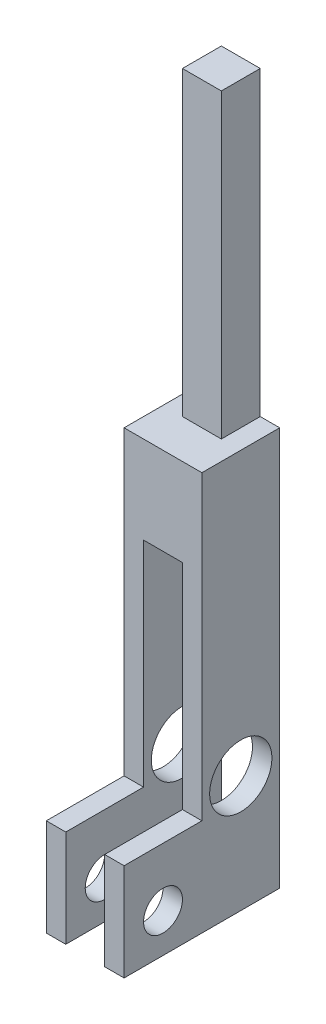
ISO-10303-21;
HEADER;
FILE_DESCRIPTION(('STEP AP214'),'2;1');
FILE_NAME('part.step','',(''),(''),'','','');
FILE_SCHEMA(('AUTOMOTIVE_DESIGN { 1 0 10303 214 1 1 1 1 }'));
ENDSEC;
DATA;
#1=APPLICATION_CONTEXT('core data for automotive mechanical design processes');
#2=APPLICATION_PROTOCOL_DEFINITION('international standard','automotive_design',2000,#1);
#3=PRODUCT_CONTEXT('',#1,'mechanical');
#4=PRODUCT('Part','Part','',(#3));
#5=PRODUCT_RELATED_PRODUCT_CATEGORY('part','',(#4));
#6=PRODUCT_DEFINITION_FORMATION('','',#4);
#7=PRODUCT_DEFINITION_CONTEXT('part definition',#1,'design');
#8=PRODUCT_DEFINITION('design','',#6,#7);
#9=PRODUCT_DEFINITION_SHAPE('','',#8);
#10=(LENGTH_UNIT() NAMED_UNIT(*) SI_UNIT(.MILLI.,.METRE.));
#11=(NAMED_UNIT(*) PLANE_ANGLE_UNIT() SI_UNIT($,.RADIAN.));
#12=(NAMED_UNIT(*) SI_UNIT($,.STERADIAN.) SOLID_ANGLE_UNIT());
#13=UNCERTAINTY_MEASURE_WITH_UNIT(LENGTH_MEASURE(1.E-05),#10,'distance_accuracy_value','');
#14=(GEOMETRIC_REPRESENTATION_CONTEXT(3) GLOBAL_UNCERTAINTY_ASSIGNED_CONTEXT((#13)) GLOBAL_UNIT_ASSIGNED_CONTEXT((#10,
#11,#12)) REPRESENTATION_CONTEXT('',''));
#15=CARTESIAN_POINT('',(0.,0.,0.));
#16=DIRECTION('',(0.,0.,1.));
#17=DIRECTION('',(1.,0.,0.));
#18=AXIS2_PLACEMENT_3D('',#15,#16,#17);
#19=CARTESIAN_POINT('',(0.,180.,0.));
#20=DIRECTION('',(0.,0.,-1.));
#21=DIRECTION('',(-1.,0.,0.));
#22=AXIS2_PLACEMENT_3D('',#19,#20,#21);
#23=PLANE('',#22);
#24=DIRECTION('',(1.,0.,0.));
#25=VECTOR('',#24,1.);
#26=CARTESIAN_POINT('',(0.,0.,0.));
#27=LINE('',#26,#25);
#28=CARTESIAN_POINT('',(0.,0.,0.));
#29=VERTEX_POINT('',#28);
#30=CARTESIAN_POINT('',(5.,0.,0.));
#31=VERTEX_POINT('',#30);
#32=EDGE_CURVE('E222',#29,#31,#27,.T.);
#33=ORIENTED_EDGE('',*,*,#32,.T.);
#34=DIRECTION('',(0.,1.,0.));
#35=VECTOR('',#34,1.);
#36=CARTESIAN_POINT('',(5.,180.,0.));
#37=LINE('',#36,#35);
#38=CARTESIAN_POINT('',(5.,25.,0.));
#39=VERTEX_POINT('',#38);
#40=EDGE_CURVE('E185',#31,#39,#37,.T.);
#41=ORIENTED_EDGE('',*,*,#40,.T.);
#42=DIRECTION('',(-1.,0.,0.));
#43=VECTOR('',#42,1.);
#44=CARTESIAN_POINT('',(28.9999999999999,25.,0.));
#45=LINE('',#44,#43);
#46=CARTESIAN_POINT('',(0.,25.,0.));
#47=VERTEX_POINT('',#46);
#48=EDGE_CURVE('E205',#39,#47,#45,.T.);
#49=ORIENTED_EDGE('',*,*,#48,.T.);
#50=DIRECTION('',(0.,-1.,0.));
#51=VECTOR('',#50,1.);
#52=CARTESIAN_POINT('',(0.,180.,0.));
#53=LINE('',#52,#51);
#54=EDGE_CURVE('E243',#47,#29,#53,.T.);
#55=ORIENTED_EDGE('',*,*,#54,.T.);
#56=EDGE_LOOP('',(#33,#41,#49,#55));
#57=FACE_BOUND('',#56,.T.);
#58=ADVANCED_FACE('F39',(#57),#23,.F.);
#59=CARTESIAN_POINT('',(0.,0.,0.));
#60=DIRECTION('',(0.,-1.,0.));
#61=DIRECTION('',(0.,0.,-1.));
#62=AXIS2_PLACEMENT_3D('',#59,#60,#61);
#63=PLANE('',#62);
#64=DIRECTION('',(0.,0.,-1.));
#65=VECTOR('',#64,1.);
#66=CARTESIAN_POINT('',(5.,0.,8.99999999999989));
#67=LINE('',#66,#65);
#68=CARTESIAN_POINT('',(5.,0.,-40.));
#69=VERTEX_POINT('',#68);
#70=EDGE_CURVE('E321',#31,#69,#67,.T.);
#71=ORIENTED_EDGE('',*,*,#70,.F.);
#72=ORIENTED_EDGE('',*,*,#32,.F.);
#73=DIRECTION('',(0.,0.,1.));
#74=VECTOR('',#73,1.);
#75=CARTESIAN_POINT('',(0.,0.,0.));
#76=LINE('',#75,#74);
#77=CARTESIAN_POINT('',(0.,0.,-40.));
#78=VERTEX_POINT('',#77);
#79=EDGE_CURVE('E212',#78,#29,#76,.T.);
#80=ORIENTED_EDGE('',*,*,#79,.F.);
#81=DIRECTION('',(-1.,0.,0.));
#82=VECTOR('',#81,1.);
#83=CARTESIAN_POINT('',(0.,0.,-40.));
#84=LINE('',#83,#82);
#85=EDGE_CURVE('E230',#69,#78,#84,.T.);
#86=ORIENTED_EDGE('',*,*,#85,.F.);
#87=EDGE_LOOP('',(#71,#72,#80,#86));
#88=FACE_BOUND('',#87,.T.);
#89=ADVANCED_FACE('F365',(#88),#63,.T.);
#90=CARTESIAN_POINT('',(28.9999999999999,25.,-20.));
#91=DIRECTION('',(0.,-1.,0.));
#92=DIRECTION('',(0.,0.,-1.));
#93=AXIS2_PLACEMENT_3D('',#90,#91,#92);
#94=PLANE('',#93);
#95=ORIENTED_EDGE('',*,*,#48,.F.);
#96=DIRECTION('',(0.,0.,-1.));
#97=VECTOR('',#96,1.);
#98=CARTESIAN_POINT('',(5.,25.,-20.));
#99=LINE('',#98,#97);
#100=CARTESIAN_POINT('',(5.,25.,-20.));
#101=VERTEX_POINT('',#100);
#102=EDGE_CURVE('E340',#39,#101,#99,.T.);
#103=ORIENTED_EDGE('',*,*,#102,.T.);
#104=DIRECTION('',(-1.,0.,0.));
#105=VECTOR('',#104,1.);
#106=CARTESIAN_POINT('',(28.9999999999999,25.,-20.));
#107=LINE('',#106,#105);
#108=CARTESIAN_POINT('',(0.,25.,-20.));
#109=VERTEX_POINT('',#108);
#110=EDGE_CURVE('E199',#101,#109,#107,.T.);
#111=ORIENTED_EDGE('',*,*,#110,.T.);
#112=DIRECTION('',(0.,0.,1.));
#113=VECTOR('',#112,1.);
#114=CARTESIAN_POINT('',(0.,25.,-20.));
#115=LINE('',#114,#113);
#116=EDGE_CURVE('E195',#109,#47,#115,.T.);
#117=ORIENTED_EDGE('',*,*,#116,.T.);
#118=EDGE_LOOP('',(#95,#103,#111,#117));
#119=FACE_BOUND('',#118,.T.);
#120=ADVANCED_FACE('F352',(#119),#94,.F.);
#121=CARTESIAN_POINT('',(0.,180.,0.));
#122=DIRECTION('',(1.,0.,0.));
#123=DIRECTION('',(0.,0.,-1.));
#124=AXIS2_PLACEMENT_3D('',#121,#122,#123);
#125=PLANE('',#124);
#126=CARTESIAN_POINT('',(0.,30.,-30.));
#127=DIRECTION('',(1.,0.,0.));
#128=DIRECTION('',(0.,0.,-1.));
#129=AXIS2_PLACEMENT_3D('',#126,#127,#128);
#130=CIRCLE('',#129,8.);
#131=CARTESIAN_POINT('',(0.,30.,-38.));
#132=VERTEX_POINT('',#131);
#133=EDGE_CURVE('E272',#132,#132,#130,.T.);
#134=ORIENTED_EDGE('',*,*,#133,.T.);
#135=EDGE_LOOP('',(#134));
#136=FACE_BOUND('',#135,.T.);
#137=CARTESIAN_POINT('',(0.,10.,-10.));
#138=DIRECTION('',(1.,0.,0.));
#139=DIRECTION('',(0.,0.,-1.));
#140=AXIS2_PLACEMENT_3D('',#137,#138,#139);
#141=CIRCLE('',#140,5.);
#142=CARTESIAN_POINT('',(0.,10.,-15.));
#143=VERTEX_POINT('',#142);
#144=EDGE_CURVE('E172',#143,#143,#141,.T.);
#145=ORIENTED_EDGE('',*,*,#144,.T.);
#146=EDGE_LOOP('',(#145));
#147=FACE_BOUND('',#146,.T.);
#148=DIRECTION('',(0.,0.,1.));
#149=VECTOR('',#148,1.);
#150=CARTESIAN_POINT('',(0.,102.5,-20.));
#151=LINE('',#150,#149);
#152=CARTESIAN_POINT('',(0.,102.5,-40.));
#153=VERTEX_POINT('',#152);
#154=CARTESIAN_POINT('',(0.,102.5,-20.));
#155=VERTEX_POINT('',#154);
#156=EDGE_CURVE('E179',#153,#155,#151,.T.);
#157=ORIENTED_EDGE('',*,*,#156,.F.);
#158=DIRECTION('',(0.,-1.,0.));
#159=VECTOR('',#158,1.);
#160=CARTESIAN_POINT('',(0.,180.,-40.));
#161=LINE('',#160,#159);
#162=EDGE_CURVE('E216',#153,#78,#161,.T.);
#163=ORIENTED_EDGE('',*,*,#162,.T.);
#164=ORIENTED_EDGE('',*,*,#79,.T.);
#165=ORIENTED_EDGE('',*,*,#54,.F.);
#166=ORIENTED_EDGE('',*,*,#116,.F.);
#167=DIRECTION('',(0.,-1.,0.));
#168=VECTOR('',#167,1.);
#169=CARTESIAN_POINT('',(0.,25.,-20.));
#170=LINE('',#169,#168);
#171=EDGE_CURVE('E191',#155,#109,#170,.T.);
#172=ORIENTED_EDGE('',*,*,#171,.F.);
#173=EDGE_LOOP('',(#157,#163,#164,#165,#166,#172));
#174=FACE_BOUND('',#173,.T.);
#175=ADVANCED_FACE('F41',(#136,#147,#174),#125,.F.);
#176=CARTESIAN_POINT('',(20.,25.,0.));
#177=VERTEX_POINT('',#176);
#178=CARTESIAN_POINT('',(15.,25.,0.));
#179=VERTEX_POINT('',#178);
#180=EDGE_CURVE('E200',#177,#179,#45,.T.);
#181=ORIENTED_EDGE('',*,*,#180,.T.);
#182=DIRECTION('',(0.,-1.,0.));
#183=VECTOR('',#182,1.);
#184=CARTESIAN_POINT('',(15.,180.,0.));
#185=LINE('',#184,#183);
#186=CARTESIAN_POINT('',(15.,0.,0.));
#187=VERTEX_POINT('',#186);
#188=EDGE_CURVE('E336',#179,#187,#185,.T.);
#189=ORIENTED_EDGE('',*,*,#188,.T.);
#190=CARTESIAN_POINT('',(20.,0.,0.));
#191=VERTEX_POINT('',#190);
#192=EDGE_CURVE('E221',#187,#191,#27,.T.);
#193=ORIENTED_EDGE('',*,*,#192,.T.);
#194=DIRECTION('',(0.,-1.,0.));
#195=VECTOR('',#194,1.);
#196=CARTESIAN_POINT('',(20.,180.,0.));
#197=LINE('',#196,#195);
#198=EDGE_CURVE('E239',#177,#191,#197,.T.);
#199=ORIENTED_EDGE('',*,*,#198,.F.);
#200=EDGE_LOOP('',(#181,#189,#193,#199));
#201=FACE_BOUND('',#200,.T.);
#202=ADVANCED_FACE('F388',(#201),#23,.F.);
#203=CARTESIAN_POINT('',(20.,180.,0.));
#204=DIRECTION('',(-1.,0.,0.));
#205=DIRECTION('',(0.,0.,1.));
#206=AXIS2_PLACEMENT_3D('',#203,#204,#205);
#207=PLANE('',#206);
#208=CARTESIAN_POINT('',(20.,30.,-30.));
#209=DIRECTION('',(1.,0.,0.));
#210=DIRECTION('',(0.,0.,-1.));
#211=AXIS2_PLACEMENT_3D('',#208,#209,#210);
#212=CIRCLE('',#211,8.);
#213=CARTESIAN_POINT('',(20.,30.,-38.));
#214=VERTEX_POINT('',#213);
#215=EDGE_CURVE('E457',#214,#214,#212,.T.);
#216=ORIENTED_EDGE('',*,*,#215,.F.);
#217=EDGE_LOOP('',(#216));
#218=FACE_BOUND('',#217,.T.);
#219=CARTESIAN_POINT('',(20.,10.,-10.));
#220=DIRECTION('',(1.,0.,0.));
#221=DIRECTION('',(0.,0.,-1.));
#222=AXIS2_PLACEMENT_3D('',#219,#220,#221);
#223=CIRCLE('',#222,5.);
#224=CARTESIAN_POINT('',(20.,10.,-15.));
#225=VERTEX_POINT('',#224);
#226=EDGE_CURVE('E264',#225,#225,#223,.T.);
#227=ORIENTED_EDGE('',*,*,#226,.F.);
#228=EDGE_LOOP('',(#227));
#229=FACE_BOUND('',#228,.T.);
#230=DIRECTION('',(0.,-1.,0.));
#231=VECTOR('',#230,1.);
#232=CARTESIAN_POINT('',(20.,180.,-40.));
#233=LINE('',#232,#231);
#234=CARTESIAN_POINT('',(20.,102.5,-40.));
#235=VERTEX_POINT('',#234);
#236=CARTESIAN_POINT('',(20.,0.,-40.));
#237=VERTEX_POINT('',#236);
#238=EDGE_CURVE('E236',#235,#237,#233,.T.);
#239=ORIENTED_EDGE('',*,*,#238,.F.);
#240=DIRECTION('',(0.,0.,1.));
#241=VECTOR('',#240,1.);
#242=CARTESIAN_POINT('',(20.,102.5,0.));
#243=LINE('',#242,#241);
#244=CARTESIAN_POINT('',(20.,102.5,-20.));
#245=VERTEX_POINT('',#244);
#246=EDGE_CURVE('E183',#235,#245,#243,.T.);
#247=ORIENTED_EDGE('',*,*,#246,.T.);
#248=DIRECTION('',(0.,-1.,0.));
#249=VECTOR('',#248,1.);
#250=CARTESIAN_POINT('',(20.,180.,-20.));
#251=LINE('',#250,#249);
#252=CARTESIAN_POINT('',(20.,25.,-20.));
#253=VERTEX_POINT('',#252);
#254=EDGE_CURVE('E204',#245,#253,#251,.T.);
#255=ORIENTED_EDGE('',*,*,#254,.T.);
#256=DIRECTION('',(0.,0.,1.));
#257=VECTOR('',#256,1.);
#258=CARTESIAN_POINT('',(20.,25.,0.));
#259=LINE('',#258,#257);
#260=EDGE_CURVE('E246',#253,#177,#259,.T.);
#261=ORIENTED_EDGE('',*,*,#260,.T.);
#262=ORIENTED_EDGE('',*,*,#198,.T.);
#263=DIRECTION('',(0.,0.,-1.));
#264=VECTOR('',#263,1.);
#265=CARTESIAN_POINT('',(20.,0.,0.));
#266=LINE('',#265,#264);
#267=EDGE_CURVE('E226',#191,#237,#266,.T.);
#268=ORIENTED_EDGE('',*,*,#267,.T.);
#269=EDGE_LOOP('',(#239,#247,#255,#261,#262,#268));
#270=FACE_BOUND('',#269,.T.);
#271=ADVANCED_FACE('F385',(#218,#229,#270),#207,.F.);
#272=CARTESIAN_POINT('',(0.,180.,-40.));
#273=DIRECTION('',(0.,0.,1.));
#274=DIRECTION('',(1.,0.,0.));
#275=AXIS2_PLACEMENT_3D('',#272,#273,#274);
#276=PLANE('',#275);
#277=DIRECTION('',(0.,-1.,0.));
#278=VECTOR('',#277,1.);
#279=CARTESIAN_POINT('',(15.,180.,-40.));
#280=LINE('',#279,#278);
#281=CARTESIAN_POINT('',(15.,180.,-40.));
#282=VERTEX_POINT('',#281);
#283=CARTESIAN_POINT('',(15.,102.5,-40.));
#284=VERTEX_POINT('',#283);
#285=EDGE_CURVE('E157',#282,#284,#280,.T.);
#286=ORIENTED_EDGE('',*,*,#285,.T.);
#287=DIRECTION('',(1.,0.,0.));
#288=VECTOR('',#287,1.);
#289=CARTESIAN_POINT('',(0.,102.5,-40.));
#290=LINE('',#289,#288);
#291=EDGE_CURVE('E289',#284,#235,#290,.T.);
#292=ORIENTED_EDGE('',*,*,#291,.T.);
#293=ORIENTED_EDGE('',*,*,#238,.T.);
#294=CARTESIAN_POINT('',(15.,0.,-40.));
#295=VERTEX_POINT('',#294);
#296=EDGE_CURVE('E217',#237,#295,#84,.T.);
#297=ORIENTED_EDGE('',*,*,#296,.T.);
#298=DIRECTION('',(0.,-1.,0.));
#299=VECTOR('',#298,1.);
#300=CARTESIAN_POINT('',(15.,0.,-40.));
#301=LINE('',#300,#299);
#302=CARTESIAN_POINT('',(15.,80.,-40.));
#303=VERTEX_POINT('',#302);
#304=EDGE_CURVE('E317',#303,#295,#301,.T.);
#305=ORIENTED_EDGE('',*,*,#304,.F.);
#306=DIRECTION('',(1.,0.,0.));
#307=VECTOR('',#306,1.);
#308=CARTESIAN_POINT('',(5.,80.,-40.));
#309=LINE('',#308,#307);
#310=CARTESIAN_POINT('',(5.,80.,-40.));
#311=VERTEX_POINT('',#310);
#312=EDGE_CURVE('E314',#311,#303,#309,.T.);
#313=ORIENTED_EDGE('',*,*,#312,.F.);
#314=DIRECTION('',(0.,1.,0.));
#315=VECTOR('',#314,1.);
#316=CARTESIAN_POINT('',(5.,0.,-40.));
#317=LINE('',#316,#315);
#318=EDGE_CURVE('E310',#69,#311,#317,.T.);
#319=ORIENTED_EDGE('',*,*,#318,.F.);
#320=ORIENTED_EDGE('',*,*,#85,.T.);
#321=ORIENTED_EDGE('',*,*,#162,.F.);
#322=DIRECTION('',(1.,0.,0.));
#323=VECTOR('',#322,1.);
#324=CARTESIAN_POINT('',(0.,102.5,-40.));
#325=LINE('',#324,#323);
#326=CARTESIAN_POINT('',(5.,102.5,-40.));
#327=VERTEX_POINT('',#326);
#328=EDGE_CURVE('E299',#153,#327,#325,.T.);
#329=ORIENTED_EDGE('',*,*,#328,.T.);
#330=DIRECTION('',(0.,1.,0.));
#331=VECTOR('',#330,1.);
#332=CARTESIAN_POINT('',(4.99999999999999,180.,-40.));
#333=LINE('',#332,#331);
#334=CARTESIAN_POINT('',(4.99999999999999,180.,-40.));
#335=VERTEX_POINT('',#334);
#336=EDGE_CURVE('E306',#327,#335,#333,.T.);
#337=ORIENTED_EDGE('',*,*,#336,.T.);
#338=DIRECTION('',(-1.,0.,0.));
#339=VECTOR('',#338,1.);
#340=CARTESIAN_POINT('',(0.,180.,-40.));
#341=LINE('',#340,#339);
#342=EDGE_CURVE('E213',#282,#335,#341,.T.);
#343=ORIENTED_EDGE('',*,*,#342,.F.);
#344=EDGE_LOOP('',(#286,#292,#293,#297,#305,#313,#319,#320,#321,#329,#337,#343));
#345=FACE_BOUND('',#344,.T.);
#346=ADVANCED_FACE('F373',(#345),#276,.F.);
#347=CARTESIAN_POINT('',(0.,180.,0.));
#348=DIRECTION('',(0.,-1.,0.));
#349=DIRECTION('',(0.,0.,-1.));
#350=AXIS2_PLACEMENT_3D('',#347,#348,#349);
#351=PLANE('',#350);
#352=DIRECTION('',(-1.,0.,0.));
#353=VECTOR('',#352,1.);
#354=CARTESIAN_POINT('',(28.9999999999999,180.,-30.));
#355=LINE('',#354,#353);
#356=CARTESIAN_POINT('',(15.,180.,-30.));
#357=VERTEX_POINT('',#356);
#358=CARTESIAN_POINT('',(4.99999999999999,180.,-30.));
#359=VERTEX_POINT('',#358);
#360=EDGE_CURVE('E168',#357,#359,#355,.T.);
#361=ORIENTED_EDGE('',*,*,#360,.F.);
#362=DIRECTION('',(0.,0.,1.));
#363=VECTOR('',#362,1.);
#364=CARTESIAN_POINT('',(15.,180.,-78.9999999999999));
#365=LINE('',#364,#363);
#366=EDGE_CURVE('E154',#282,#357,#365,.T.);
#367=ORIENTED_EDGE('',*,*,#366,.F.);
#368=ORIENTED_EDGE('',*,*,#342,.T.);
#369=DIRECTION('',(0.,0.,1.));
#370=VECTOR('',#369,1.);
#371=CARTESIAN_POINT('',(4.99999999999999,180.,-78.9999999999999));
#372=LINE('',#371,#370);
#373=EDGE_CURVE('E177',#335,#359,#372,.T.);
#374=ORIENTED_EDGE('',*,*,#373,.T.);
#375=EDGE_LOOP('',(#361,#367,#368,#374));
#376=FACE_BOUND('',#375,.T.);
#377=ADVANCED_FACE('F175',(#376),#351,.F.);
#378=DIRECTION('',(0.,0.,-1.));
#379=VECTOR('',#378,1.);
#380=CARTESIAN_POINT('',(15.,0.,8.99999999999989));
#381=LINE('',#380,#379);
#382=EDGE_CURVE('E325',#187,#295,#381,.T.);
#383=ORIENTED_EDGE('',*,*,#382,.T.);
#384=ORIENTED_EDGE('',*,*,#296,.F.);
#385=ORIENTED_EDGE('',*,*,#267,.F.);
#386=ORIENTED_EDGE('',*,*,#192,.F.);
#387=EDGE_LOOP('',(#383,#384,#385,#386));
#388=FACE_BOUND('',#387,.T.);
#389=ADVANCED_FACE('F393',(#388),#63,.T.);
#390=CARTESIAN_POINT('',(15.,25.,-20.));
#391=VERTEX_POINT('',#390);
#392=EDGE_CURVE('E206',#253,#391,#107,.T.);
#393=ORIENTED_EDGE('',*,*,#392,.T.);
#394=DIRECTION('',(0.,0.,1.));
#395=VECTOR('',#394,1.);
#396=CARTESIAN_POINT('',(15.,25.,-20.));
#397=LINE('',#396,#395);
#398=EDGE_CURVE('E324',#391,#179,#397,.T.);
#399=ORIENTED_EDGE('',*,*,#398,.T.);
#400=ORIENTED_EDGE('',*,*,#180,.F.);
#401=ORIENTED_EDGE('',*,*,#260,.F.);
#402=EDGE_LOOP('',(#393,#399,#400,#401));
#403=FACE_BOUND('',#402,.T.);
#404=ADVANCED_FACE('F381',(#403),#94,.F.);
#405=CARTESIAN_POINT('',(28.9999999999999,25.,-20.));
#406=DIRECTION('',(0.,0.,-1.));
#407=DIRECTION('',(-1.,0.,0.));
#408=AXIS2_PLACEMENT_3D('',#405,#406,#407);
#409=PLANE('',#408);
#410=ORIENTED_EDGE('',*,*,#110,.F.);
#411=DIRECTION('',(0.,1.,0.));
#412=VECTOR('',#411,1.);
#413=CARTESIAN_POINT('',(5.,25.,-20.));
#414=LINE('',#413,#412);
#415=CARTESIAN_POINT('',(5.,80.,-20.));
#416=VERTEX_POINT('',#415);
#417=EDGE_CURVE('E11',#101,#416,#414,.T.);
#418=ORIENTED_EDGE('',*,*,#417,.T.);
#419=DIRECTION('',(1.,0.,0.));
#420=VECTOR('',#419,1.);
#421=CARTESIAN_POINT('',(28.9999999999999,80.,-20.));
#422=LINE('',#421,#420);
#423=CARTESIAN_POINT('',(15.,80.,-20.));
#424=VERTEX_POINT('',#423);
#425=EDGE_CURVE('E254',#416,#424,#422,.T.);
#426=ORIENTED_EDGE('',*,*,#425,.T.);
#427=DIRECTION('',(0.,-1.,0.));
#428=VECTOR('',#427,1.);
#429=CARTESIAN_POINT('',(15.,25.,-20.));
#430=LINE('',#429,#428);
#431=EDGE_CURVE('E49',#424,#391,#430,.T.);
#432=ORIENTED_EDGE('',*,*,#431,.T.);
#433=ORIENTED_EDGE('',*,*,#392,.F.);
#434=ORIENTED_EDGE('',*,*,#254,.F.);
#435=DIRECTION('',(-1.,0.,0.));
#436=VECTOR('',#435,1.);
#437=CARTESIAN_POINT('',(28.9999999999999,102.5,-20.));
#438=LINE('',#437,#436);
#439=EDGE_CURVE('E250',#245,#155,#438,.T.);
#440=ORIENTED_EDGE('',*,*,#439,.T.);
#441=ORIENTED_EDGE('',*,*,#171,.T.);
#442=EDGE_LOOP('',(#410,#418,#426,#432,#433,#434,#440,#441));
#443=FACE_BOUND('',#442,.T.);
#444=ADVANCED_FACE('F360',(#443),#409,.F.);
#445=CARTESIAN_POINT('',(28.9999999999999,102.5,-30.));
#446=DIRECTION('',(0.,0.,-1.));
#447=DIRECTION('',(-1.,0.,0.));
#448=AXIS2_PLACEMENT_3D('',#445,#446,#447);
#449=PLANE('',#448);
#450=DIRECTION('',(-1.,0.,0.));
#451=VECTOR('',#450,1.);
#452=CARTESIAN_POINT('',(28.9999999999999,102.5,-30.));
#453=LINE('',#452,#451);
#454=CARTESIAN_POINT('',(15.,102.5,-30.));
#455=VERTEX_POINT('',#454);
#456=CARTESIAN_POINT('',(5.,102.5,-30.));
#457=VERTEX_POINT('',#456);
#458=EDGE_CURVE('E170',#455,#457,#453,.T.);
#459=ORIENTED_EDGE('',*,*,#458,.F.);
#460=DIRECTION('',(0.,-1.,0.));
#461=VECTOR('',#460,1.);
#462=CARTESIAN_POINT('',(15.,180.,-30.));
#463=LINE('',#462,#461);
#464=EDGE_CURVE('E57',#357,#455,#463,.T.);
#465=ORIENTED_EDGE('',*,*,#464,.F.);
#466=ORIENTED_EDGE('',*,*,#360,.T.);
#467=DIRECTION('',(0.,1.,0.));
#468=VECTOR('',#467,1.);
#469=CARTESIAN_POINT('',(4.99999999999999,180.,-30.));
#470=LINE('',#469,#468);
#471=EDGE_CURVE('E293',#457,#359,#470,.T.);
#472=ORIENTED_EDGE('',*,*,#471,.F.);
#473=EDGE_LOOP('',(#459,#465,#466,#472));
#474=FACE_BOUND('',#473,.T.);
#475=ADVANCED_FACE('F166',(#474),#449,.F.);
#476=CARTESIAN_POINT('',(28.9999999999999,102.5,-20.));
#477=DIRECTION('',(0.,-1.,0.));
#478=DIRECTION('',(0.,0.,-1.));
#479=AXIS2_PLACEMENT_3D('',#476,#477,#478);
#480=PLANE('',#479);
#481=ORIENTED_EDGE('',*,*,#246,.F.);
#482=ORIENTED_EDGE('',*,*,#291,.F.);
#483=DIRECTION('',(0.,0.,1.));
#484=VECTOR('',#483,1.);
#485=CARTESIAN_POINT('',(15.,102.5,-78.9999999999999));
#486=LINE('',#485,#484);
#487=EDGE_CURVE('E162',#284,#455,#486,.T.);
#488=ORIENTED_EDGE('',*,*,#487,.T.);
#489=ORIENTED_EDGE('',*,*,#458,.T.);
#490=DIRECTION('',(0.,0.,1.));
#491=VECTOR('',#490,1.);
#492=CARTESIAN_POINT('',(5.,102.5,-78.9999999999999));
#493=LINE('',#492,#491);
#494=EDGE_CURVE('E296',#327,#457,#493,.T.);
#495=ORIENTED_EDGE('',*,*,#494,.F.);
#496=ORIENTED_EDGE('',*,*,#328,.F.);
#497=ORIENTED_EDGE('',*,*,#156,.T.);
#498=ORIENTED_EDGE('',*,*,#439,.F.);
#499=EDGE_LOOP('',(#481,#482,#488,#489,#495,#496,#497,#498));
#500=FACE_BOUND('',#499,.T.);
#501=ADVANCED_FACE('F396',(#500),#480,.F.);
#502=CARTESIAN_POINT('',(5.,0.,8.99999999999989));
#503=DIRECTION('',(-1.,0.,0.));
#504=DIRECTION('',(0.,0.,1.));
#505=AXIS2_PLACEMENT_3D('',#502,#503,#504);
#506=PLANE('',#505);
#507=CARTESIAN_POINT('',(5.,30.,-30.));
#508=DIRECTION('',(-1.,0.,0.));
#509=DIRECTION('',(0.,0.,1.));
#510=AXIS2_PLACEMENT_3D('',#507,#508,#509);
#511=CIRCLE('',#510,8.);
#512=CARTESIAN_POINT('',(5.,30.,-22.));
#513=VERTEX_POINT('',#512);
#514=EDGE_CURVE('E278',#513,#513,#511,.T.);
#515=ORIENTED_EDGE('',*,*,#514,.T.);
#516=EDGE_LOOP('',(#515));
#517=FACE_BOUND('',#516,.T.);
#518=CARTESIAN_POINT('',(5.,10.,-10.));
#519=DIRECTION('',(-1.,0.,0.));
#520=DIRECTION('',(0.,0.,1.));
#521=AXIS2_PLACEMENT_3D('',#518,#519,#520);
#522=CIRCLE('',#521,5.);
#523=CARTESIAN_POINT('',(5.,10.,-5.));
#524=VERTEX_POINT('',#523);
#525=EDGE_CURVE('E263',#524,#524,#522,.T.);
#526=ORIENTED_EDGE('',*,*,#525,.T.);
#527=EDGE_LOOP('',(#526));
#528=FACE_BOUND('',#527,.T.);
#529=ORIENTED_EDGE('',*,*,#70,.T.);
#530=ORIENTED_EDGE('',*,*,#318,.T.);
#531=DIRECTION('',(0.,0.,-1.));
#532=VECTOR('',#531,1.);
#533=CARTESIAN_POINT('',(5.,80.,8.99999999999989));
#534=LINE('',#533,#532);
#535=EDGE_CURVE('E320',#416,#311,#534,.T.);
#536=ORIENTED_EDGE('',*,*,#535,.F.);
#537=ORIENTED_EDGE('',*,*,#417,.F.);
#538=ORIENTED_EDGE('',*,*,#102,.F.);
#539=ORIENTED_EDGE('',*,*,#40,.F.);
#540=EDGE_LOOP('',(#529,#530,#536,#537,#538,#539));
#541=FACE_BOUND('',#540,.T.);
#542=ADVANCED_FACE('F369',(#517,#528,#541),#506,.F.);
#543=CARTESIAN_POINT('',(15.,0.,8.99999999999989));
#544=DIRECTION('',(1.,0.,0.));
#545=DIRECTION('',(0.,0.,-1.));
#546=AXIS2_PLACEMENT_3D('',#543,#544,#545);
#547=PLANE('',#546);
#548=CARTESIAN_POINT('',(15.,30.,-30.));
#549=DIRECTION('',(1.,0.,0.));
#550=DIRECTION('',(0.,0.,-1.));
#551=AXIS2_PLACEMENT_3D('',#548,#549,#550);
#552=CIRCLE('',#551,8.);
#553=CARTESIAN_POINT('',(15.,30.,-38.));
#554=VERTEX_POINT('',#553);
#555=EDGE_CURVE('E43',#554,#554,#552,.T.);
#556=ORIENTED_EDGE('',*,*,#555,.T.);
#557=EDGE_LOOP('',(#556));
#558=FACE_BOUND('',#557,.T.);
#559=CARTESIAN_POINT('',(15.,10.,-10.));
#560=DIRECTION('',(1.,0.,0.));
#561=DIRECTION('',(0.,0.,-1.));
#562=AXIS2_PLACEMENT_3D('',#559,#560,#561);
#563=CIRCLE('',#562,5.);
#564=CARTESIAN_POINT('',(15.,10.,-15.));
#565=VERTEX_POINT('',#564);
#566=EDGE_CURVE('E260',#565,#565,#563,.T.);
#567=ORIENTED_EDGE('',*,*,#566,.T.);
#568=EDGE_LOOP('',(#567));
#569=FACE_BOUND('',#568,.T.);
#570=ORIENTED_EDGE('',*,*,#398,.F.);
#571=ORIENTED_EDGE('',*,*,#431,.F.);
#572=DIRECTION('',(0.,0.,-1.));
#573=VECTOR('',#572,1.);
#574=CARTESIAN_POINT('',(15.,80.,8.99999999999989));
#575=LINE('',#574,#573);
#576=EDGE_CURVE('E65',#424,#303,#575,.T.);
#577=ORIENTED_EDGE('',*,*,#576,.T.);
#578=ORIENTED_EDGE('',*,*,#304,.T.);
#579=ORIENTED_EDGE('',*,*,#382,.F.);
#580=ORIENTED_EDGE('',*,*,#188,.F.);
#581=EDGE_LOOP('',(#570,#571,#577,#578,#579,#580));
#582=FACE_BOUND('',#581,.T.);
#583=ADVANCED_FACE('F409',(#558,#569,#582),#547,.F.);
#584=CARTESIAN_POINT('',(5.,80.,8.99999999999989));
#585=DIRECTION('',(0.,1.,0.));
#586=DIRECTION('',(0.,0.,1.));
#587=AXIS2_PLACEMENT_3D('',#584,#585,#586);
#588=PLANE('',#587);
#589=ORIENTED_EDGE('',*,*,#535,.T.);
#590=ORIENTED_EDGE('',*,*,#312,.T.);
#591=ORIENTED_EDGE('',*,*,#576,.F.);
#592=ORIENTED_EDGE('',*,*,#425,.F.);
#593=EDGE_LOOP('',(#589,#590,#591,#592));
#594=FACE_BOUND('',#593,.T.);
#595=ADVANCED_FACE('F376',(#594),#588,.F.);
#596=CARTESIAN_POINT('',(4.99999999999999,180.,-78.9999999999999));
#597=DIRECTION('',(1.,0.,0.));
#598=DIRECTION('',(0.,1.,0.));
#599=AXIS2_PLACEMENT_3D('',#596,#597,#598);
#600=PLANE('',#599);
#601=ORIENTED_EDGE('',*,*,#494,.T.);
#602=ORIENTED_EDGE('',*,*,#471,.T.);
#603=ORIENTED_EDGE('',*,*,#373,.F.);
#604=ORIENTED_EDGE('',*,*,#336,.F.);
#605=EDGE_LOOP('',(#601,#602,#603,#604));
#606=FACE_BOUND('',#605,.T.);
#607=ADVANCED_FACE('F400',(#606),#600,.F.);
#608=CARTESIAN_POINT('',(15.,180.,-78.9999999999999));
#609=DIRECTION('',(-1.,0.,0.));
#610=DIRECTION('',(0.,-1.,0.));
#611=AXIS2_PLACEMENT_3D('',#608,#609,#610);
#612=PLANE('',#611);
#613=ORIENTED_EDGE('',*,*,#366,.T.);
#614=ORIENTED_EDGE('',*,*,#464,.T.);
#615=ORIENTED_EDGE('',*,*,#487,.F.);
#616=ORIENTED_EDGE('',*,*,#285,.F.);
#617=EDGE_LOOP('',(#613,#614,#615,#616));
#618=FACE_BOUND('',#617,.T.);
#619=ADVANCED_FACE('F155',(#618),#612,.F.);
#620=CARTESIAN_POINT('',(-28.9999999999999,10.,-10.));
#621=DIRECTION('',(1.,0.,0.));
#622=DIRECTION('',(0.,0.,-1.));
#623=AXIS2_PLACEMENT_3D('',#620,#621,#622);
#624=CYLINDRICAL_SURFACE('',#623,5.);
#625=ORIENTED_EDGE('',*,*,#226,.T.);
#626=EDGE_LOOP('',(#625));
#627=FACE_BOUND('',#626,.T.);
#628=ORIENTED_EDGE('',*,*,#566,.F.);
#629=EDGE_LOOP('',(#628));
#630=FACE_BOUND('',#629,.T.);
#631=ADVANCED_FACE('F407',(#627,#630),#624,.F.);
#632=ORIENTED_EDGE('',*,*,#525,.F.);
#633=EDGE_LOOP('',(#632));
#634=FACE_BOUND('',#633,.T.);
#635=ORIENTED_EDGE('',*,*,#144,.F.);
#636=EDGE_LOOP('',(#635));
#637=FACE_BOUND('',#636,.T.);
#638=ADVANCED_FACE('F433',(#634,#637),#624,.F.);
#639=CARTESIAN_POINT('',(-28.9999999999999,30.,-30.));
#640=DIRECTION('',(1.,0.,0.));
#641=DIRECTION('',(0.,0.,-1.));
#642=AXIS2_PLACEMENT_3D('',#639,#640,#641);
#643=CYLINDRICAL_SURFACE('',#642,8.);
#644=ORIENTED_EDGE('',*,*,#215,.T.);
#645=EDGE_LOOP('',(#644));
#646=FACE_BOUND('',#645,.T.);
#647=ORIENTED_EDGE('',*,*,#555,.F.);
#648=EDGE_LOOP('',(#647));
#649=FACE_BOUND('',#648,.T.);
#650=ADVANCED_FACE('F435',(#646,#649),#643,.F.);
#651=ORIENTED_EDGE('',*,*,#514,.F.);
#652=EDGE_LOOP('',(#651));
#653=FACE_BOUND('',#652,.T.);
#654=ORIENTED_EDGE('',*,*,#133,.F.);
#655=EDGE_LOOP('',(#654));
#656=FACE_BOUND('',#655,.T.);
#657=ADVANCED_FACE('F442',(#653,#656),#643,.F.);
#658=CLOSED_SHELL('',(#58,#89,#120,#175,#202,#271,#346,#377,#389,#404,#444,#475,#501,#542,#583,
#595,#607,#619,#631,#638,#650,#657));
#659=MANIFOLD_SOLID_BREP('B2',#658);
#660=ADVANCED_BREP_SHAPE_REPRESENTATION('',(#18,#659),#14);
#661=SHAPE_DEFINITION_REPRESENTATION(#9,#660);
ENDSEC;
END-ISO-10303-21;
